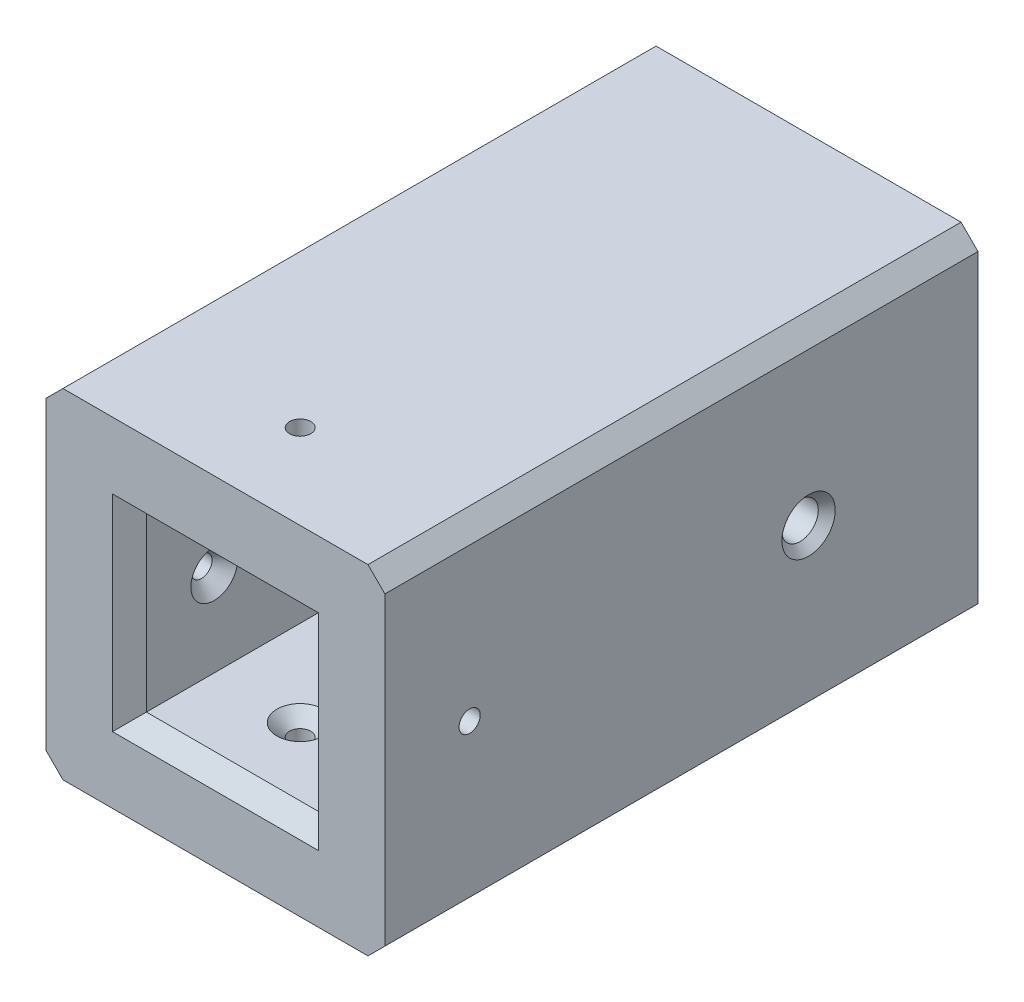
ISO-10303-21;
HEADER;
FILE_DESCRIPTION(('STEP AP214'),'2;1');
FILE_NAME('part.step','',(''),(''),'','','');
FILE_SCHEMA(('AUTOMOTIVE_DESIGN { 1 0 10303 214 1 1 1 1 }'));
ENDSEC;
DATA;
#1=APPLICATION_CONTEXT('core data for automotive mechanical design processes');
#2=APPLICATION_PROTOCOL_DEFINITION('international standard','automotive_design',2000,#1);
#3=PRODUCT_CONTEXT('',#1,'mechanical');
#4=PRODUCT('Part','Part','',(#3));
#5=PRODUCT_RELATED_PRODUCT_CATEGORY('part','',(#4));
#6=PRODUCT_DEFINITION_FORMATION('','',#4);
#7=PRODUCT_DEFINITION_CONTEXT('part definition',#1,'design');
#8=PRODUCT_DEFINITION('design','',#6,#7);
#9=PRODUCT_DEFINITION_SHAPE('','',#8);
#10=(LENGTH_UNIT() NAMED_UNIT(*) SI_UNIT(.MILLI.,.METRE.));
#11=(NAMED_UNIT(*) PLANE_ANGLE_UNIT() SI_UNIT($,.RADIAN.));
#12=(NAMED_UNIT(*) SI_UNIT($,.STERADIAN.) SOLID_ANGLE_UNIT());
#13=UNCERTAINTY_MEASURE_WITH_UNIT(LENGTH_MEASURE(1.E-05),#10,'distance_accuracy_value','');
#14=(GEOMETRIC_REPRESENTATION_CONTEXT(3) GLOBAL_UNCERTAINTY_ASSIGNED_CONTEXT((#13)) GLOBAL_UNIT_ASSIGNED_CONTEXT((#10,
#11,#12)) REPRESENTATION_CONTEXT('',''));
#15=CARTESIAN_POINT('',(0.,0.,0.));
#16=DIRECTION('',(0.,0.,1.));
#17=DIRECTION('',(1.,0.,0.));
#18=AXIS2_PLACEMENT_3D('',#15,#16,#17);
#19=CARTESIAN_POINT('',(0.,0.,94.));
#20=DIRECTION('',(1.,0.,0.));
#21=DIRECTION('',(0.,0.,-1.));
#22=AXIS2_PLACEMENT_3D('',#19,#20,#21);
#23=PLANE('',#22);
#24=CARTESIAN_POINT('',(0.,20.,84.));
#25=DIRECTION('',(-1.,0.,0.));
#26=DIRECTION('',(0.,0.,1.));
#27=AXIS2_PLACEMENT_3D('',#24,#25,#26);
#28=CIRCLE('',#27,1.25);
#29=CARTESIAN_POINT('',(0.,20.,85.25));
#30=VERTEX_POINT('',#29);
#31=EDGE_CURVE('E271',#30,#30,#28,.T.);
#32=ORIENTED_EDGE('',*,*,#31,.F.);
#33=EDGE_LOOP('',(#32));
#34=FACE_BOUND('',#33,.T.);
#35=CARTESIAN_POINT('',(0.,20.,44.));
#36=DIRECTION('',(1.,0.,0.));
#37=DIRECTION('',(0.,0.,-1.));
#38=AXIS2_PLACEMENT_3D('',#35,#36,#37);
#39=CIRCLE('',#38,3.14999999999996);
#40=CARTESIAN_POINT('',(0.,20.,40.85));
#41=VERTEX_POINT('',#40);
#42=EDGE_CURVE('E209',#41,#41,#39,.T.);
#43=ORIENTED_EDGE('',*,*,#42,.T.);
#44=EDGE_LOOP('',(#43));
#45=FACE_BOUND('',#44,.T.);
#46=DIRECTION('',(0.,1.,0.));
#47=VECTOR('',#46,1.);
#48=CARTESIAN_POINT('',(0.,0.,24.));
#49=LINE('',#48,#47);
#50=CARTESIAN_POINT('',(0.,2.00000000000002,24.));
#51=VERTEX_POINT('',#50);
#52=CARTESIAN_POINT('',(0.,38.,24.));
#53=VERTEX_POINT('',#52);
#54=EDGE_CURVE('E291',#51,#53,#49,.T.);
#55=ORIENTED_EDGE('',*,*,#54,.F.);
#56=DIRECTION('',(0.,0.,1.));
#57=VECTOR('',#56,1.);
#58=CARTESIAN_POINT('',(0.,2.00000000000002,94.));
#59=LINE('',#58,#57);
#60=CARTESIAN_POINT('',(0.,2.00000000000002,94.));
#61=VERTEX_POINT('',#60);
#62=EDGE_CURVE('E191',#51,#61,#59,.T.);
#63=ORIENTED_EDGE('',*,*,#62,.T.);
#64=DIRECTION('',(0.,-1.,0.));
#65=VECTOR('',#64,1.);
#66=CARTESIAN_POINT('',(0.,0.,94.));
#67=LINE('',#66,#65);
#68=CARTESIAN_POINT('',(0.,38.,94.));
#69=VERTEX_POINT('',#68);
#70=EDGE_CURVE('E313',#69,#61,#67,.T.);
#71=ORIENTED_EDGE('',*,*,#70,.F.);
#72=DIRECTION('',(0.,0.,-1.));
#73=VECTOR('',#72,1.);
#74=CARTESIAN_POINT('',(0.,38.,94.));
#75=LINE('',#74,#73);
#76=EDGE_CURVE('E181',#69,#53,#75,.T.);
#77=ORIENTED_EDGE('',*,*,#76,.T.);
#78=EDGE_LOOP('',(#55,#63,#71,#77));
#79=FACE_BOUND('',#78,.T.);
#80=ADVANCED_FACE('F36',(#34,#45,#79),#23,.F.);
#81=CARTESIAN_POINT('',(0.,0.,94.));
#82=DIRECTION('',(0.,1.,0.));
#83=DIRECTION('',(0.,0.,1.));
#84=AXIS2_PLACEMENT_3D('',#81,#82,#83);
#85=PLANE('',#84);
#86=CARTESIAN_POINT('',(20.,0.,84.));
#87=DIRECTION('',(0.,-1.,0.));
#88=DIRECTION('',(0.,0.,-1.));
#89=AXIS2_PLACEMENT_3D('',#86,#87,#88);
#90=CIRCLE('',#89,1.25);
#91=CARTESIAN_POINT('',(20.,0.,82.75));
#92=VERTEX_POINT('',#91);
#93=EDGE_CURVE('E297',#92,#92,#90,.T.);
#94=ORIENTED_EDGE('',*,*,#93,.F.);
#95=EDGE_LOOP('',(#94));
#96=FACE_BOUND('',#95,.T.);
#97=DIRECTION('',(-1.,0.,0.));
#98=VECTOR('',#97,1.);
#99=CARTESIAN_POINT('',(0.,0.,24.));
#100=LINE('',#99,#98);
#101=CARTESIAN_POINT('',(38.,0.,24.));
#102=VERTEX_POINT('',#101);
#103=CARTESIAN_POINT('',(2.,0.,24.));
#104=VERTEX_POINT('',#103);
#105=EDGE_CURVE('E155',#102,#104,#100,.T.);
#106=ORIENTED_EDGE('',*,*,#105,.F.);
#107=DIRECTION('',(0.,0.,1.));
#108=VECTOR('',#107,1.);
#109=CARTESIAN_POINT('',(38.,0.,94.));
#110=LINE('',#109,#108);
#111=CARTESIAN_POINT('',(38.,0.,94.));
#112=VERTEX_POINT('',#111);
#113=EDGE_CURVE('E170',#102,#112,#110,.T.);
#114=ORIENTED_EDGE('',*,*,#113,.T.);
#115=DIRECTION('',(1.,0.,0.));
#116=VECTOR('',#115,1.);
#117=CARTESIAN_POINT('',(0.,0.,94.));
#118=LINE('',#117,#116);
#119=CARTESIAN_POINT('',(2.,0.,94.));
#120=VERTEX_POINT('',#119);
#121=EDGE_CURVE('E316',#120,#112,#118,.T.);
#122=ORIENTED_EDGE('',*,*,#121,.F.);
#123=DIRECTION('',(0.,0.,-1.));
#124=VECTOR('',#123,1.);
#125=CARTESIAN_POINT('',(2.,0.,94.));
#126=LINE('',#125,#124);
#127=EDGE_CURVE('E173',#120,#104,#126,.T.);
#128=ORIENTED_EDGE('',*,*,#127,.T.);
#129=EDGE_LOOP('',(#106,#114,#122,#128));
#130=FACE_BOUND('',#129,.T.);
#131=ADVANCED_FACE('F168',(#96,#130),#85,.F.);
#132=CARTESIAN_POINT('',(40.,0.,94.));
#133=DIRECTION('',(-1.,0.,0.));
#134=DIRECTION('',(0.,0.,1.));
#135=AXIS2_PLACEMENT_3D('',#132,#133,#134);
#136=PLANE('',#135);
#137=CARTESIAN_POINT('',(40.,20.,84.));
#138=DIRECTION('',(-1.,0.,0.));
#139=DIRECTION('',(0.,0.,1.));
#140=AXIS2_PLACEMENT_3D('',#137,#138,#139);
#141=CIRCLE('',#140,1.25);
#142=CARTESIAN_POINT('',(40.,20.,85.25));
#143=VERTEX_POINT('',#142);
#144=EDGE_CURVE('E277',#143,#143,#141,.T.);
#145=ORIENTED_EDGE('',*,*,#144,.T.);
#146=EDGE_LOOP('',(#145));
#147=FACE_BOUND('',#146,.T.);
#148=CARTESIAN_POINT('',(40.,20.,44.));
#149=DIRECTION('',(-1.,0.,0.));
#150=DIRECTION('',(0.,0.,1.));
#151=AXIS2_PLACEMENT_3D('',#148,#149,#150);
#152=CIRCLE('',#151,3.15000000000007);
#153=CARTESIAN_POINT('',(40.,20.,47.1500000000001));
#154=VERTEX_POINT('',#153);
#155=EDGE_CURVE('E164',#154,#154,#152,.T.);
#156=ORIENTED_EDGE('',*,*,#155,.T.);
#157=EDGE_LOOP('',(#156));
#158=FACE_BOUND('',#157,.T.);
#159=DIRECTION('',(0.,-1.,0.));
#160=VECTOR('',#159,1.);
#161=CARTESIAN_POINT('',(40.,0.,24.));
#162=LINE('',#161,#160);
#163=CARTESIAN_POINT('',(40.,38.,24.));
#164=VERTEX_POINT('',#163);
#165=CARTESIAN_POINT('',(40.,2.,24.));
#166=VERTEX_POINT('',#165);
#167=EDGE_CURVE('E158',#164,#166,#162,.T.);
#168=ORIENTED_EDGE('',*,*,#167,.F.);
#169=DIRECTION('',(0.,0.,1.));
#170=VECTOR('',#169,1.);
#171=CARTESIAN_POINT('',(40.,38.,94.));
#172=LINE('',#171,#170);
#173=CARTESIAN_POINT('',(40.,38.,94.));
#174=VERTEX_POINT('',#173);
#175=EDGE_CURVE('E207',#164,#174,#172,.T.);
#176=ORIENTED_EDGE('',*,*,#175,.T.);
#177=DIRECTION('',(0.,1.,0.));
#178=VECTOR('',#177,1.);
#179=CARTESIAN_POINT('',(40.,0.,94.));
#180=LINE('',#179,#178);
#181=CARTESIAN_POINT('',(40.,2.,94.));
#182=VERTEX_POINT('',#181);
#183=EDGE_CURVE('E318',#182,#174,#180,.T.);
#184=ORIENTED_EDGE('',*,*,#183,.F.);
#185=DIRECTION('',(0.,0.,-1.));
#186=VECTOR('',#185,1.);
#187=CARTESIAN_POINT('',(40.,2.,94.));
#188=LINE('',#187,#186);
#189=EDGE_CURVE('E205',#182,#166,#188,.T.);
#190=ORIENTED_EDGE('',*,*,#189,.T.);
#191=EDGE_LOOP('',(#168,#176,#184,#190));
#192=FACE_BOUND('',#191,.T.);
#193=ADVANCED_FACE('F400',(#147,#158,#192),#136,.F.);
#194=CARTESIAN_POINT('',(0.,40.,94.));
#195=DIRECTION('',(0.,-1.,0.));
#196=DIRECTION('',(0.,0.,-1.));
#197=AXIS2_PLACEMENT_3D('',#194,#195,#196);
#198=PLANE('',#197);
#199=CARTESIAN_POINT('',(20.,40.,84.));
#200=DIRECTION('',(0.,-1.,0.));
#201=DIRECTION('',(0.,0.,-1.));
#202=AXIS2_PLACEMENT_3D('',#199,#200,#201);
#203=CIRCLE('',#202,1.25);
#204=CARTESIAN_POINT('',(20.,40.,82.75));
#205=VERTEX_POINT('',#204);
#206=EDGE_CURVE('E300',#205,#205,#203,.T.);
#207=ORIENTED_EDGE('',*,*,#206,.T.);
#208=EDGE_LOOP('',(#207));
#209=FACE_BOUND('',#208,.T.);
#210=DIRECTION('',(1.,0.,0.));
#211=VECTOR('',#210,1.);
#212=CARTESIAN_POINT('',(0.,40.,24.));
#213=LINE('',#212,#211);
#214=CARTESIAN_POINT('',(2.00000000000002,40.,24.));
#215=VERTEX_POINT('',#214);
#216=CARTESIAN_POINT('',(38.,40.,24.));
#217=VERTEX_POINT('',#216);
#218=EDGE_CURVE('E289',#215,#217,#213,.T.);
#219=ORIENTED_EDGE('',*,*,#218,.F.);
#220=DIRECTION('',(0.,0.,1.));
#221=VECTOR('',#220,1.);
#222=CARTESIAN_POINT('',(2.00000000000002,40.,94.));
#223=LINE('',#222,#221);
#224=CARTESIAN_POINT('',(2.00000000000002,40.,94.));
#225=VERTEX_POINT('',#224);
#226=EDGE_CURVE('E203',#215,#225,#223,.T.);
#227=ORIENTED_EDGE('',*,*,#226,.T.);
#228=DIRECTION('',(-1.,0.,0.));
#229=VECTOR('',#228,1.);
#230=CARTESIAN_POINT('',(0.,40.,94.));
#231=LINE('',#230,#229);
#232=CARTESIAN_POINT('',(38.,40.,94.));
#233=VERTEX_POINT('',#232);
#234=EDGE_CURVE('E321',#233,#225,#231,.T.);
#235=ORIENTED_EDGE('',*,*,#234,.F.);
#236=DIRECTION('',(0.,0.,-1.));
#237=VECTOR('',#236,1.);
#238=CARTESIAN_POINT('',(38.,40.,94.));
#239=LINE('',#238,#237);
#240=EDGE_CURVE('E200',#233,#217,#239,.T.);
#241=ORIENTED_EDGE('',*,*,#240,.T.);
#242=EDGE_LOOP('',(#219,#227,#235,#241));
#243=FACE_BOUND('',#242,.T.);
#244=ADVANCED_FACE('F521',(#209,#243),#198,.F.);
#245=CARTESIAN_POINT('',(9.85,9.85,94.));
#246=DIRECTION('',(1.,0.,0.));
#247=DIRECTION('',(0.,0.,-1.));
#248=AXIS2_PLACEMENT_3D('',#245,#246,#247);
#249=PLANE('',#248);
#250=CARTESIAN_POINT('',(9.85,20.,84.));
#251=DIRECTION('',(1.,0.,0.));
#252=DIRECTION('',(0.,0.,-1.));
#253=AXIS2_PLACEMENT_3D('',#250,#251,#252);
#254=CIRCLE('',#253,2.74999999999999);
#255=CARTESIAN_POINT('',(9.85,20.,81.25));
#256=VERTEX_POINT('',#255);
#257=EDGE_CURVE('E233',#256,#256,#254,.F.);
#258=ORIENTED_EDGE('',*,*,#257,.T.);
#259=EDGE_LOOP('',(#258));
#260=FACE_BOUND('',#259,.T.);
#261=CARTESIAN_POINT('',(9.85,20.,44.));
#262=DIRECTION('',(1.,0.,0.));
#263=DIRECTION('',(0.,0.,-1.));
#264=AXIS2_PLACEMENT_3D('',#261,#262,#263);
#265=CIRCLE('',#264,2.15);
#266=CARTESIAN_POINT('',(9.85,20.,41.85));
#267=VERTEX_POINT('',#266);
#268=EDGE_CURVE('E213',#267,#267,#265,.T.);
#269=ORIENTED_EDGE('',*,*,#268,.F.);
#270=EDGE_LOOP('',(#269));
#271=FACE_BOUND('',#270,.T.);
#272=DIRECTION('',(0.,0.,-1.));
#273=VECTOR('',#272,1.);
#274=CARTESIAN_POINT('',(9.85,9.85,94.));
#275=LINE('',#274,#273);
#276=CARTESIAN_POINT('',(9.85,9.85,92.));
#277=VERTEX_POINT('',#276);
#278=CARTESIAN_POINT('',(9.85,9.85,26.));
#279=VERTEX_POINT('',#278);
#280=EDGE_CURVE('E310',#277,#279,#275,.T.);
#281=ORIENTED_EDGE('',*,*,#280,.T.);
#282=DIRECTION('',(0.,1.,0.));
#283=VECTOR('',#282,1.);
#284=CARTESIAN_POINT('',(9.85,9.85,26.));
#285=LINE('',#284,#283);
#286=CARTESIAN_POINT('',(9.85,30.15,26.));
#287=VERTEX_POINT('',#286);
#288=EDGE_CURVE('E248',#279,#287,#285,.T.);
#289=ORIENTED_EDGE('',*,*,#288,.T.);
#290=DIRECTION('',(0.,0.,-1.));
#291=VECTOR('',#290,1.);
#292=CARTESIAN_POINT('',(9.85,30.15,94.));
#293=LINE('',#292,#291);
#294=CARTESIAN_POINT('',(9.85,30.15,92.));
#295=VERTEX_POINT('',#294);
#296=EDGE_CURVE('E304',#295,#287,#293,.T.);
#297=ORIENTED_EDGE('',*,*,#296,.F.);
#298=DIRECTION('',(0.,-1.,0.));
#299=VECTOR('',#298,1.);
#300=CARTESIAN_POINT('',(9.85,9.85,92.));
#301=LINE('',#300,#299);
#302=EDGE_CURVE('E324',#295,#277,#301,.T.);
#303=ORIENTED_EDGE('',*,*,#302,.T.);
#304=EDGE_LOOP('',(#281,#289,#297,#303));
#305=FACE_BOUND('',#304,.T.);
#306=ADVANCED_FACE('F371',(#260,#271,#305),#249,.T.);
#307=CARTESIAN_POINT('',(9.85,9.85,94.));
#308=DIRECTION('',(0.,1.,0.));
#309=DIRECTION('',(0.,0.,1.));
#310=AXIS2_PLACEMENT_3D('',#307,#308,#309);
#311=PLANE('',#310);
#312=CARTESIAN_POINT('',(20.,9.85,84.));
#313=DIRECTION('',(0.,1.,0.));
#314=DIRECTION('',(0.,0.,1.));
#315=AXIS2_PLACEMENT_3D('',#312,#313,#314);
#316=CIRCLE('',#315,2.74999999999999);
#317=CARTESIAN_POINT('',(20.,9.85,86.75));
#318=VERTEX_POINT('',#317);
#319=EDGE_CURVE('E227',#318,#318,#316,.F.);
#320=ORIENTED_EDGE('',*,*,#319,.T.);
#321=EDGE_LOOP('',(#320));
#322=FACE_BOUND('',#321,.T.);
#323=DIRECTION('',(0.,0.,-1.));
#324=VECTOR('',#323,1.);
#325=CARTESIAN_POINT('',(30.15,9.85,94.));
#326=LINE('',#325,#324);
#327=CARTESIAN_POINT('',(30.15,9.85,92.));
#328=VERTEX_POINT('',#327);
#329=CARTESIAN_POINT('',(30.15,9.85,26.));
#330=VERTEX_POINT('',#329);
#331=EDGE_CURVE('E308',#328,#330,#326,.T.);
#332=ORIENTED_EDGE('',*,*,#331,.T.);
#333=DIRECTION('',(-1.,0.,0.));
#334=VECTOR('',#333,1.);
#335=CARTESIAN_POINT('',(9.85,9.85,26.));
#336=LINE('',#335,#334);
#337=EDGE_CURVE('E11',#330,#279,#336,.T.);
#338=ORIENTED_EDGE('',*,*,#337,.T.);
#339=ORIENTED_EDGE('',*,*,#280,.F.);
#340=DIRECTION('',(1.,0.,0.));
#341=VECTOR('',#340,1.);
#342=CARTESIAN_POINT('',(30.15,9.85,92.));
#343=LINE('',#342,#341);
#344=EDGE_CURVE('E336',#277,#328,#343,.T.);
#345=ORIENTED_EDGE('',*,*,#344,.T.);
#346=EDGE_LOOP('',(#332,#338,#339,#345));
#347=FACE_BOUND('',#346,.T.);
#348=ADVANCED_FACE('F373',(#322,#347),#311,.T.);
#349=CARTESIAN_POINT('',(30.15,9.85,94.));
#350=DIRECTION('',(-1.,0.,0.));
#351=DIRECTION('',(0.,0.,1.));
#352=AXIS2_PLACEMENT_3D('',#349,#350,#351);
#353=PLANE('',#352);
#354=CARTESIAN_POINT('',(30.15,20.,84.));
#355=DIRECTION('',(-1.,0.,0.));
#356=DIRECTION('',(0.,0.,1.));
#357=AXIS2_PLACEMENT_3D('',#354,#355,#356);
#358=CIRCLE('',#357,2.75);
#359=CARTESIAN_POINT('',(30.15,20.,86.75));
#360=VERTEX_POINT('',#359);
#361=EDGE_CURVE('E245',#360,#360,#358,.F.);
#362=ORIENTED_EDGE('',*,*,#361,.T.);
#363=EDGE_LOOP('',(#362));
#364=FACE_BOUND('',#363,.T.);
#365=CARTESIAN_POINT('',(30.15,20.,44.));
#366=DIRECTION('',(-1.,0.,0.));
#367=DIRECTION('',(0.,0.,1.));
#368=AXIS2_PLACEMENT_3D('',#365,#366,#367);
#369=CIRCLE('',#368,2.15);
#370=CARTESIAN_POINT('',(30.15,20.,41.85));
#371=VERTEX_POINT('',#370);
#372=EDGE_CURVE('E210',#371,#371,#369,.T.);
#373=ORIENTED_EDGE('',*,*,#372,.F.);
#374=EDGE_LOOP('',(#373));
#375=FACE_BOUND('',#374,.T.);
#376=DIRECTION('',(0.,0.,-1.));
#377=VECTOR('',#376,1.);
#378=CARTESIAN_POINT('',(30.15,30.15,94.));
#379=LINE('',#378,#377);
#380=CARTESIAN_POINT('',(30.15,30.15,92.));
#381=VERTEX_POINT('',#380);
#382=CARTESIAN_POINT('',(30.15,30.15,26.));
#383=VERTEX_POINT('',#382);
#384=EDGE_CURVE('E306',#381,#383,#379,.T.);
#385=ORIENTED_EDGE('',*,*,#384,.T.);
#386=DIRECTION('',(0.,-1.,0.));
#387=VECTOR('',#386,1.);
#388=CARTESIAN_POINT('',(30.15,9.85,26.));
#389=LINE('',#388,#387);
#390=EDGE_CURVE('E46',#383,#330,#389,.T.);
#391=ORIENTED_EDGE('',*,*,#390,.T.);
#392=ORIENTED_EDGE('',*,*,#331,.F.);
#393=DIRECTION('',(0.,1.,0.));
#394=VECTOR('',#393,1.);
#395=CARTESIAN_POINT('',(30.15,30.15,92.));
#396=LINE('',#395,#394);
#397=EDGE_CURVE('E183',#328,#381,#396,.T.);
#398=ORIENTED_EDGE('',*,*,#397,.T.);
#399=EDGE_LOOP('',(#385,#391,#392,#398));
#400=FACE_BOUND('',#399,.T.);
#401=ADVANCED_FACE('F381',(#364,#375,#400),#353,.T.);
#402=CARTESIAN_POINT('',(9.85,30.15,94.));
#403=DIRECTION('',(0.,-1.,0.));
#404=DIRECTION('',(0.,0.,-1.));
#405=AXIS2_PLACEMENT_3D('',#402,#403,#404);
#406=PLANE('',#405);
#407=CARTESIAN_POINT('',(20.,30.15,84.));
#408=DIRECTION('',(0.,-1.,0.));
#409=DIRECTION('',(0.,0.,-1.));
#410=AXIS2_PLACEMENT_3D('',#407,#408,#409);
#411=CIRCLE('',#410,2.75000000000002);
#412=CARTESIAN_POINT('',(20.,30.15,81.25));
#413=VERTEX_POINT('',#412);
#414=EDGE_CURVE('E239',#413,#413,#411,.F.);
#415=ORIENTED_EDGE('',*,*,#414,.T.);
#416=EDGE_LOOP('',(#415));
#417=FACE_BOUND('',#416,.T.);
#418=ORIENTED_EDGE('',*,*,#296,.T.);
#419=DIRECTION('',(1.,0.,0.));
#420=VECTOR('',#419,1.);
#421=CARTESIAN_POINT('',(9.85,30.15,26.));
#422=LINE('',#421,#420);
#423=EDGE_CURVE('E61',#287,#383,#422,.T.);
#424=ORIENTED_EDGE('',*,*,#423,.T.);
#425=ORIENTED_EDGE('',*,*,#384,.F.);
#426=DIRECTION('',(-1.,0.,0.));
#427=VECTOR('',#426,1.);
#428=CARTESIAN_POINT('',(9.85,30.15,92.));
#429=LINE('',#428,#427);
#430=EDGE_CURVE('E179',#381,#295,#429,.T.);
#431=ORIENTED_EDGE('',*,*,#430,.T.);
#432=EDGE_LOOP('',(#418,#424,#425,#431));
#433=FACE_BOUND('',#432,.T.);
#434=ADVANCED_FACE('F380',(#417,#433),#406,.T.);
#435=CARTESIAN_POINT('',(2.,0.,94.));
#436=DIRECTION('',(0.70710678118655,0.707106781186545,0.));
#437=DIRECTION('',(0.,0.,-1.));
#438=AXIS2_PLACEMENT_3D('',#435,#436,#437);
#439=PLANE('',#438);
#440=ORIENTED_EDGE('',*,*,#62,.F.);
#441=DIRECTION('',(-0.707106781186545,0.70710678118655,0.));
#442=VECTOR('',#441,1.);
#443=CARTESIAN_POINT('',(2.,0.,24.));
#444=LINE('',#443,#442);
#445=EDGE_CURVE('E287',#51,#104,#444,.F.);
#446=ORIENTED_EDGE('',*,*,#445,.T.);
#447=ORIENTED_EDGE('',*,*,#127,.F.);
#448=DIRECTION('',(-0.707106781186545,0.70710678118655,0.));
#449=VECTOR('',#448,1.);
#450=CARTESIAN_POINT('',(2.,0.,94.));
#451=LINE('',#450,#449);
#452=EDGE_CURVE('E198',#61,#120,#451,.F.);
#453=ORIENTED_EDGE('',*,*,#452,.F.);
#454=EDGE_LOOP('',(#440,#446,#447,#453));
#455=FACE_BOUND('',#454,.T.);
#456=ADVANCED_FACE('F428',(#455),#439,.F.);
#457=CARTESIAN_POINT('',(0.,38.,94.));
#458=DIRECTION('',(0.707106781186545,-0.70710678118655,0.));
#459=DIRECTION('',(0.,0.,-1.));
#460=AXIS2_PLACEMENT_3D('',#457,#458,#459);
#461=PLANE('',#460);
#462=ORIENTED_EDGE('',*,*,#226,.F.);
#463=DIRECTION('',(0.70710678118655,0.707106781186545,0.));
#464=VECTOR('',#463,1.);
#465=CARTESIAN_POINT('',(0.,38.,24.));
#466=LINE('',#465,#464);
#467=EDGE_CURVE('E214',#215,#53,#466,.F.);
#468=ORIENTED_EDGE('',*,*,#467,.T.);
#469=ORIENTED_EDGE('',*,*,#76,.F.);
#470=DIRECTION('',(0.70710678118655,0.707106781186545,0.));
#471=VECTOR('',#470,1.);
#472=CARTESIAN_POINT('',(0.,38.,94.));
#473=LINE('',#472,#471);
#474=EDGE_CURVE('E196',#225,#69,#473,.F.);
#475=ORIENTED_EDGE('',*,*,#474,.F.);
#476=EDGE_LOOP('',(#462,#468,#469,#475));
#477=FACE_BOUND('',#476,.T.);
#478=ADVANCED_FACE('F434',(#477),#461,.F.);
#479=CARTESIAN_POINT('',(38.,40.,94.));
#480=DIRECTION('',(-0.70710678118655,-0.707106781186545,0.));
#481=DIRECTION('',(0.,0.,-1.));
#482=AXIS2_PLACEMENT_3D('',#479,#480,#481);
#483=PLANE('',#482);
#484=ORIENTED_EDGE('',*,*,#175,.F.);
#485=DIRECTION('',(0.707106781186545,-0.70710678118655,0.));
#486=VECTOR('',#485,1.);
#487=CARTESIAN_POINT('',(38.,40.,24.));
#488=LINE('',#487,#486);
#489=EDGE_CURVE('E174',#164,#217,#488,.F.);
#490=ORIENTED_EDGE('',*,*,#489,.T.);
#491=ORIENTED_EDGE('',*,*,#240,.F.);
#492=DIRECTION('',(0.707106781186545,-0.70710678118655,0.));
#493=VECTOR('',#492,1.);
#494=CARTESIAN_POINT('',(38.,40.,94.));
#495=LINE('',#494,#493);
#496=EDGE_CURVE('E194',#174,#233,#495,.F.);
#497=ORIENTED_EDGE('',*,*,#496,.F.);
#498=EDGE_LOOP('',(#484,#490,#491,#497));
#499=FACE_BOUND('',#498,.T.);
#500=ADVANCED_FACE('F441',(#499),#483,.F.);
#501=CARTESIAN_POINT('',(40.,2.,94.));
#502=DIRECTION('',(-0.707106781186545,0.70710678118655,0.));
#503=DIRECTION('',(0.,0.,-1.));
#504=AXIS2_PLACEMENT_3D('',#501,#502,#503);
#505=PLANE('',#504);
#506=ORIENTED_EDGE('',*,*,#113,.F.);
#507=DIRECTION('',(-0.70710678118655,-0.707106781186545,0.));
#508=VECTOR('',#507,1.);
#509=CARTESIAN_POINT('',(40.,2.,24.));
#510=LINE('',#509,#508);
#511=EDGE_CURVE('E152',#102,#166,#510,.F.);
#512=ORIENTED_EDGE('',*,*,#511,.T.);
#513=ORIENTED_EDGE('',*,*,#189,.F.);
#514=DIRECTION('',(-0.70710678118655,-0.707106781186545,0.));
#515=VECTOR('',#514,1.);
#516=CARTESIAN_POINT('',(40.,2.,94.));
#517=LINE('',#516,#515);
#518=EDGE_CURVE('E178',#112,#182,#517,.F.);
#519=ORIENTED_EDGE('',*,*,#518,.F.);
#520=EDGE_LOOP('',(#506,#512,#513,#519));
#521=FACE_BOUND('',#520,.T.);
#522=ADVANCED_FACE('F177',(#521),#505,.F.);
#523=CARTESIAN_POINT('',(0.,0.,94.));
#524=DIRECTION('',(0.,0.,-1.));
#525=DIRECTION('',(-1.,0.,0.));
#526=AXIS2_PLACEMENT_3D('',#523,#524,#525);
#527=PLANE('',#526);
#528=DIRECTION('',(-1.,0.,0.));
#529=VECTOR('',#528,1.);
#530=CARTESIAN_POINT('',(9.85,7.85,94.));
#531=LINE('',#530,#529);
#532=CARTESIAN_POINT('',(32.15,7.85,94.));
#533=VERTEX_POINT('',#532);
#534=CARTESIAN_POINT('',(7.85,7.85,94.));
#535=VERTEX_POINT('',#534);
#536=EDGE_CURVE('E331',#533,#535,#531,.T.);
#537=ORIENTED_EDGE('',*,*,#536,.T.);
#538=DIRECTION('',(0.,1.,0.));
#539=VECTOR('',#538,1.);
#540=CARTESIAN_POINT('',(7.85,30.15,94.));
#541=LINE('',#540,#539);
#542=CARTESIAN_POINT('',(7.85,32.15,94.));
#543=VERTEX_POINT('',#542);
#544=EDGE_CURVE('E333',#535,#543,#541,.T.);
#545=ORIENTED_EDGE('',*,*,#544,.T.);
#546=DIRECTION('',(1.,0.,0.));
#547=VECTOR('',#546,1.);
#548=CARTESIAN_POINT('',(30.15,32.15,94.));
#549=LINE('',#548,#547);
#550=CARTESIAN_POINT('',(32.15,32.15,94.));
#551=VERTEX_POINT('',#550);
#552=EDGE_CURVE('E327',#543,#551,#549,.T.);
#553=ORIENTED_EDGE('',*,*,#552,.T.);
#554=DIRECTION('',(0.,-1.,0.));
#555=VECTOR('',#554,1.);
#556=CARTESIAN_POINT('',(32.15,9.85,94.));
#557=LINE('',#556,#555);
#558=EDGE_CURVE('E329',#551,#533,#557,.T.);
#559=ORIENTED_EDGE('',*,*,#558,.T.);
#560=EDGE_LOOP('',(#537,#545,#553,#559));
#561=FACE_BOUND('',#560,.T.);
#562=ORIENTED_EDGE('',*,*,#70,.T.);
#563=ORIENTED_EDGE('',*,*,#452,.T.);
#564=ORIENTED_EDGE('',*,*,#121,.T.);
#565=ORIENTED_EDGE('',*,*,#518,.T.);
#566=ORIENTED_EDGE('',*,*,#183,.T.);
#567=ORIENTED_EDGE('',*,*,#496,.T.);
#568=ORIENTED_EDGE('',*,*,#234,.T.);
#569=ORIENTED_EDGE('',*,*,#474,.T.);
#570=EDGE_LOOP('',(#562,#563,#564,#565,#566,#567,#568,#569));
#571=FACE_BOUND('',#570,.T.);
#572=ADVANCED_FACE('F359',(#561,#571),#527,.F.);
#573=CARTESIAN_POINT('',(30.15,9.85,92.));
#574=DIRECTION('',(-0.707106781186543,0.,0.707106781186552));
#575=DIRECTION('',(0.,-1.,0.));
#576=AXIS2_PLACEMENT_3D('',#573,#574,#575);
#577=PLANE('',#576);
#578=DIRECTION('',(0.577350269189628,-0.577350269189628,0.57735026918962));
#579=VECTOR('',#578,1.);
#580=CARTESIAN_POINT('',(23.3833333333333,16.6166666666667,85.2333333333334));
#581=LINE('',#580,#579);
#582=EDGE_CURVE('E341',#533,#328,#581,.F.);
#583=ORIENTED_EDGE('',*,*,#582,.F.);
#584=ORIENTED_EDGE('',*,*,#558,.F.);
#585=DIRECTION('',(0.577350269189628,0.577350269189628,0.57735026918962));
#586=VECTOR('',#585,1.);
#587=CARTESIAN_POINT('',(23.3833333333333,23.3833333333333,85.2333333333334));
#588=LINE('',#587,#586);
#589=EDGE_CURVE('E186',#381,#551,#588,.T.);
#590=ORIENTED_EDGE('',*,*,#589,.F.);
#591=ORIENTED_EDGE('',*,*,#397,.F.);
#592=EDGE_LOOP('',(#583,#584,#590,#591));
#593=FACE_BOUND('',#592,.T.);
#594=ADVANCED_FACE('F357',(#593),#577,.T.);
#595=CARTESIAN_POINT('',(9.85,30.15,92.));
#596=DIRECTION('',(0.,-0.707106781186543,0.707106781186552));
#597=DIRECTION('',(1.,0.,0.));
#598=AXIS2_PLACEMENT_3D('',#595,#596,#597);
#599=PLANE('',#598);
#600=ORIENTED_EDGE('',*,*,#589,.T.);
#601=ORIENTED_EDGE('',*,*,#552,.F.);
#602=DIRECTION('',(0.577350269189628,-0.577350269189628,-0.57735026918962));
#603=VECTOR('',#602,1.);
#604=CARTESIAN_POINT('',(16.6166666666667,23.3833333333333,85.2333333333334));
#605=LINE('',#604,#603);
#606=EDGE_CURVE('E340',#295,#543,#605,.F.);
#607=ORIENTED_EDGE('',*,*,#606,.F.);
#608=ORIENTED_EDGE('',*,*,#430,.F.);
#609=EDGE_LOOP('',(#600,#601,#607,#608));
#610=FACE_BOUND('',#609,.T.);
#611=ADVANCED_FACE('F352',(#610),#599,.T.);
#612=CARTESIAN_POINT('',(9.85,9.85,92.));
#613=DIRECTION('',(0.,0.707106781186543,0.707106781186552));
#614=DIRECTION('',(-1.,0.,0.));
#615=AXIS2_PLACEMENT_3D('',#612,#613,#614);
#616=PLANE('',#615);
#617=ORIENTED_EDGE('',*,*,#582,.T.);
#618=ORIENTED_EDGE('',*,*,#344,.F.);
#619=DIRECTION('',(-0.577350269189628,-0.577350269189628,0.57735026918962));
#620=VECTOR('',#619,1.);
#621=CARTESIAN_POINT('',(9.85,9.85,92.));
#622=LINE('',#621,#620);
#623=EDGE_CURVE('E303',#535,#277,#622,.F.);
#624=ORIENTED_EDGE('',*,*,#623,.F.);
#625=ORIENTED_EDGE('',*,*,#536,.F.);
#626=EDGE_LOOP('',(#617,#618,#624,#625));
#627=FACE_BOUND('',#626,.T.);
#628=ADVANCED_FACE('F366',(#627),#616,.T.);
#629=CARTESIAN_POINT('',(9.85,9.85,92.));
#630=DIRECTION('',(0.707106781186543,0.,0.707106781186552));
#631=DIRECTION('',(0.,1.,0.));
#632=AXIS2_PLACEMENT_3D('',#629,#630,#631);
#633=PLANE('',#632);
#634=ORIENTED_EDGE('',*,*,#606,.T.);
#635=ORIENTED_EDGE('',*,*,#544,.F.);
#636=ORIENTED_EDGE('',*,*,#623,.T.);
#637=ORIENTED_EDGE('',*,*,#302,.F.);
#638=EDGE_LOOP('',(#634,#635,#636,#637));
#639=FACE_BOUND('',#638,.T.);
#640=ADVANCED_FACE('F364',(#639),#633,.T.);
#641=CARTESIAN_POINT('',(20.,48.,84.));
#642=DIRECTION('',(0.,-1.,0.));
#643=DIRECTION('',(0.,0.,-1.));
#644=AXIS2_PLACEMENT_3D('',#641,#642,#643);
#645=CYLINDRICAL_SURFACE('',#644,1.25);
#646=CARTESIAN_POINT('',(20.,31.65,84.));
#647=DIRECTION('',(0.,-1.,0.));
#648=DIRECTION('',(0.,0.,-1.));
#649=AXIS2_PLACEMENT_3D('',#646,#647,#648);
#650=CIRCLE('',#649,1.25);
#651=CARTESIAN_POINT('',(20.,31.65,82.75));
#652=VERTEX_POINT('',#651);
#653=EDGE_CURVE('E236',#652,#652,#650,.T.);
#654=ORIENTED_EDGE('',*,*,#653,.T.);
#655=EDGE_LOOP('',(#654));
#656=FACE_BOUND('',#655,.T.);
#657=ORIENTED_EDGE('',*,*,#206,.F.);
#658=EDGE_LOOP('',(#657));
#659=FACE_BOUND('',#658,.T.);
#660=ADVANCED_FACE('F413',(#656,#659),#645,.F.);
#661=CARTESIAN_POINT('',(20.,8.35000000000001,84.));
#662=DIRECTION('',(0.,1.,0.));
#663=DIRECTION('',(0.,0.,1.));
#664=AXIS2_PLACEMENT_3D('',#661,#662,#663);
#665=CIRCLE('',#664,1.25);
#666=CARTESIAN_POINT('',(20.,8.35000000000001,85.25));
#667=VERTEX_POINT('',#666);
#668=EDGE_CURVE('E163',#667,#667,#665,.T.);
#669=ORIENTED_EDGE('',*,*,#668,.T.);
#670=EDGE_LOOP('',(#669));
#671=FACE_BOUND('',#670,.T.);
#672=ORIENTED_EDGE('',*,*,#93,.T.);
#673=EDGE_LOOP('',(#672));
#674=FACE_BOUND('',#673,.T.);
#675=ADVANCED_FACE('F561',(#671,#674),#645,.F.);
#676=CARTESIAN_POINT('',(-39.,20.,44.));
#677=DIRECTION('',(1.,0.,0.));
#678=DIRECTION('',(0.,0.,-1.));
#679=AXIS2_PLACEMENT_3D('',#676,#677,#678);
#680=CYLINDRICAL_SURFACE('',#679,2.15);
#681=CARTESIAN_POINT('',(38.9999999999999,20.,44.));
#682=DIRECTION('',(-1.,0.,0.));
#683=DIRECTION('',(0.,0.,1.));
#684=AXIS2_PLACEMENT_3D('',#681,#682,#683);
#685=CIRCLE('',#684,2.15);
#686=CARTESIAN_POINT('',(38.9999999999999,20.,41.85));
#687=VERTEX_POINT('',#686);
#688=EDGE_CURVE('E220',#687,#687,#685,.F.);
#689=CARTESIAN_POINT('',(38.9999999999999,20.,41.85));
#690=CARTESIAN_POINT('',(38.9078124999999,20.,41.85));
#691=CARTESIAN_POINT('',(38.8156249999999,20.,41.85));
#692=CARTESIAN_POINT('',(38.63125,20.,41.85));
#693=CARTESIAN_POINT('',(38.5390624999999,20.,41.85));
#694=CARTESIAN_POINT('',(38.3546874999999,20.,41.85));
#695=CARTESIAN_POINT('',(38.2624999999999,20.,41.85));
#696=CARTESIAN_POINT('',(38.078125,20.,41.85));
#697=CARTESIAN_POINT('',(37.9859375,20.,41.85));
#698=CARTESIAN_POINT('',(37.8015625,20.,41.85));
#699=CARTESIAN_POINT('',(37.7093749999999,20.,41.85));
#700=CARTESIAN_POINT('',(37.5249999999999,20.,41.85));
#701=CARTESIAN_POINT('',(37.4328125,20.,41.85));
#702=CARTESIAN_POINT('',(37.2484375,20.,41.85));
#703=CARTESIAN_POINT('',(37.15625,20.,41.85));
#704=CARTESIAN_POINT('',(36.971875,20.,41.85));
#705=CARTESIAN_POINT('',(36.8796875,20.,41.85));
#706=CARTESIAN_POINT('',(36.6953125,20.,41.85));
#707=CARTESIAN_POINT('',(36.603125,20.,41.85));
#708=CARTESIAN_POINT('',(36.41875,20.,41.85));
#709=CARTESIAN_POINT('',(36.3265625,20.,41.85));
#710=CARTESIAN_POINT('',(36.1421875,20.,41.85));
#711=CARTESIAN_POINT('',(36.05,20.,41.85));
#712=CARTESIAN_POINT('',(35.865625,20.,41.85));
#713=CARTESIAN_POINT('',(35.7734375,20.,41.85));
#714=CARTESIAN_POINT('',(35.5890625,20.,41.85));
#715=CARTESIAN_POINT('',(35.496875,20.,41.85));
#716=CARTESIAN_POINT('',(35.3125,20.,41.85));
#717=CARTESIAN_POINT('',(35.2203125,20.,41.85));
#718=CARTESIAN_POINT('',(35.0359375,20.,41.85));
#719=CARTESIAN_POINT('',(34.94375,20.,41.85));
#720=CARTESIAN_POINT('',(34.759375,20.,41.85));
#721=CARTESIAN_POINT('',(34.6671875,20.,41.85));
#722=CARTESIAN_POINT('',(34.4828125,20.,41.85));
#723=CARTESIAN_POINT('',(34.390625,20.,41.85));
#724=CARTESIAN_POINT('',(34.20625,20.,41.85));
#725=CARTESIAN_POINT('',(34.1140625,20.,41.85));
#726=CARTESIAN_POINT('',(33.9296875,20.,41.85));
#727=CARTESIAN_POINT('',(33.8375,20.,41.85));
#728=CARTESIAN_POINT('',(33.653125,20.,41.85));
#729=CARTESIAN_POINT('',(33.5609375,20.,41.85));
#730=CARTESIAN_POINT('',(33.3765625,20.,41.85));
#731=CARTESIAN_POINT('',(33.284375,20.,41.85));
#732=CARTESIAN_POINT('',(33.1,20.,41.85));
#733=CARTESIAN_POINT('',(33.0078125,20.,41.85));
#734=CARTESIAN_POINT('',(32.8234375,20.,41.85));
#735=CARTESIAN_POINT('',(32.73125,20.,41.85));
#736=CARTESIAN_POINT('',(32.546875,20.,41.85));
#737=CARTESIAN_POINT('',(32.4546875,20.,41.85));
#738=CARTESIAN_POINT('',(32.2703125,20.,41.85));
#739=CARTESIAN_POINT('',(32.178125,20.,41.85));
#740=CARTESIAN_POINT('',(31.99375,20.,41.85));
#741=CARTESIAN_POINT('',(31.9015625,20.,41.85));
#742=CARTESIAN_POINT('',(31.7171875,20.,41.85));
#743=CARTESIAN_POINT('',(31.625,20.,41.85));
#744=CARTESIAN_POINT('',(31.440625,20.,41.85));
#745=CARTESIAN_POINT('',(31.3484375,20.,41.85));
#746=CARTESIAN_POINT('',(31.1640625,20.,41.85));
#747=CARTESIAN_POINT('',(31.071875,20.,41.85));
#748=CARTESIAN_POINT('',(30.8875,20.,41.85));
#749=CARTESIAN_POINT('',(30.7953125,20.,41.85));
#750=CARTESIAN_POINT('',(30.6109375,20.,41.85));
#751=CARTESIAN_POINT('',(30.51875,20.,41.85));
#752=CARTESIAN_POINT('',(30.334375,20.,41.85));
#753=CARTESIAN_POINT('',(30.2421875,20.,41.85));
#754=CARTESIAN_POINT('',(30.15,20.,41.85));
#755=B_SPLINE_CURVE_WITH_KNOTS('',3,(#689,#690,#691,#692,#693,#694,#695,#696,#697,#698,#699,
#700,#701,#702,#703,#704,#705,#706,#707,#708,#709,#710,#711,#712,#713,#714,#715,#716,#717,#718,
#719,#720,#721,#722,#723,#724,#725,#726,#727,#728,#729,#730,#731,#732,#733,#734,#735,#736,#737,
#738,#739,#740,#741,#742,#743,#744,#745,#746,#747,#748,#749,#750,#751,#752,#753,#754),
.UNSPECIFIED.,.F.,.F.,(4,2,2,2,2,2,2,2,2,2,2,2,2,2,2,2,2,2,2,2,2,2,2,2,2,2,2,2,2,2,2,2,4),(0.,
0.276562499999994,0.553125000000002,0.829687499999995,1.10624999999999,1.3828125,
1.65937499999999,1.93593749999998,2.21249999999998,2.48906249999999,2.76562499999998,
3.04218749999997,3.31874999999998,3.59531249999998,3.87187499999997,4.14843749999998,
4.42499999999997,4.70156249999996,4.97812499999997,5.25468749999997,5.53124999999996,
5.80781249999997,6.08437499999996,6.36093749999996,6.63749999999996,6.91406249999996,
7.19062499999995,7.46718749999994,7.74374999999995,8.02031249999995,8.29687499999994,
8.57343749999995,8.84999999999994),.UNSPECIFIED.);
#756=EDGE_CURVE('BSEAM563',#687,#371,#755,.T.);
#757=ORIENTED_EDGE('',*,*,#688,.T.);
#758=ORIENTED_EDGE('',*,*,#372,.T.);
#759=ORIENTED_EDGE('',*,*,#756,.T.);
#760=ORIENTED_EDGE('',*,*,#756,.F.);
#761=EDGE_LOOP('',(#757,#759,#758,#760));
#762=FACE_BOUND('',#761,.T.);
#763=ADVANCED_FACE('F563',(#762),#680,.F.);
#764=CARTESIAN_POINT('',(0.999999999999952,20.,44.));
#765=DIRECTION('',(1.,0.,0.));
#766=DIRECTION('',(0.,0.,-1.));
#767=AXIS2_PLACEMENT_3D('',#764,#765,#766);
#768=CIRCLE('',#767,2.15);
#769=CARTESIAN_POINT('',(0.999999999999945,20.,41.85));
#770=VERTEX_POINT('',#769);
#771=EDGE_CURVE('E217',#770,#770,#768,.F.);
#772=CARTESIAN_POINT('',(0.999999999999945,20.,41.85));
#773=CARTESIAN_POINT('',(1.09218749999995,20.,41.85));
#774=CARTESIAN_POINT('',(1.18437499999995,20.,41.85));
#775=CARTESIAN_POINT('',(1.36874999999995,20.,41.85));
#776=CARTESIAN_POINT('',(1.46093749999995,20.,41.85));
#777=CARTESIAN_POINT('',(1.64531249999995,20.,41.85));
#778=CARTESIAN_POINT('',(1.73749999999995,20.,41.85));
#779=CARTESIAN_POINT('',(1.92187499999995,20.,41.85));
#780=CARTESIAN_POINT('',(2.01406249999995,20.,41.85));
#781=CARTESIAN_POINT('',(2.19843749999995,20.,41.85));
#782=CARTESIAN_POINT('',(2.29062499999995,20.,41.85));
#783=CARTESIAN_POINT('',(2.47499999999996,20.,41.85));
#784=CARTESIAN_POINT('',(2.56718749999996,20.,41.85));
#785=CARTESIAN_POINT('',(2.75156249999996,20.,41.85));
#786=CARTESIAN_POINT('',(2.84374999999996,20.,41.85));
#787=CARTESIAN_POINT('',(3.02812499999996,20.,41.85));
#788=CARTESIAN_POINT('',(3.12031249999996,20.,41.85));
#789=CARTESIAN_POINT('',(3.30468749999996,20.,41.85));
#790=CARTESIAN_POINT('',(3.39687499999996,20.,41.85));
#791=CARTESIAN_POINT('',(3.58124999999996,20.,41.85));
#792=CARTESIAN_POINT('',(3.67343749999996,20.,41.85));
#793=CARTESIAN_POINT('',(3.85781249999996,20.,41.85));
#794=CARTESIAN_POINT('',(3.94999999999996,20.,41.85));
#795=CARTESIAN_POINT('',(4.13437499999996,20.,41.85));
#796=CARTESIAN_POINT('',(4.22656249999997,20.,41.85));
#797=CARTESIAN_POINT('',(4.41093749999997,20.,41.85));
#798=CARTESIAN_POINT('',(4.50312499999997,20.,41.85));
#799=CARTESIAN_POINT('',(4.68749999999997,20.,41.85));
#800=CARTESIAN_POINT('',(4.77968749999997,20.,41.85));
#801=CARTESIAN_POINT('',(4.96406249999997,20.,41.85));
#802=CARTESIAN_POINT('',(5.05624999999997,20.,41.85));
#803=CARTESIAN_POINT('',(5.24062499999997,20.,41.85));
#804=CARTESIAN_POINT('',(5.33281249999997,20.,41.85));
#805=CARTESIAN_POINT('',(5.51718749999997,20.,41.85));
#806=CARTESIAN_POINT('',(5.60937499999997,20.,41.85));
#807=CARTESIAN_POINT('',(5.79374999999997,20.,41.85));
#808=CARTESIAN_POINT('',(5.88593749999997,20.,41.85));
#809=CARTESIAN_POINT('',(6.07031249999997,20.,41.85));
#810=CARTESIAN_POINT('',(6.16249999999997,20.,41.85));
#811=CARTESIAN_POINT('',(6.34687499999997,20.,41.85));
#812=CARTESIAN_POINT('',(6.43906249999997,20.,41.85));
#813=CARTESIAN_POINT('',(6.62343749999998,20.,41.85));
#814=CARTESIAN_POINT('',(6.71562499999998,20.,41.85));
#815=CARTESIAN_POINT('',(6.89999999999998,20.,41.85));
#816=CARTESIAN_POINT('',(6.99218749999998,20.,41.85));
#817=CARTESIAN_POINT('',(7.17656249999998,20.,41.85));
#818=CARTESIAN_POINT('',(7.26874999999998,20.,41.85));
#819=CARTESIAN_POINT('',(7.45312499999998,20.,41.85));
#820=CARTESIAN_POINT('',(7.54531249999998,20.,41.85));
#821=CARTESIAN_POINT('',(7.72968749999998,20.,41.85));
#822=CARTESIAN_POINT('',(7.82187499999999,20.,41.85));
#823=CARTESIAN_POINT('',(8.00624999999999,20.,41.85));
#824=CARTESIAN_POINT('',(8.09843749999999,20.,41.85));
#825=CARTESIAN_POINT('',(8.28281249999999,20.,41.85));
#826=CARTESIAN_POINT('',(8.37499999999999,20.,41.85));
#827=CARTESIAN_POINT('',(8.55937499999999,20.,41.85));
#828=CARTESIAN_POINT('',(8.65156249999999,20.,41.85));
#829=CARTESIAN_POINT('',(8.83593749999999,20.,41.85));
#830=CARTESIAN_POINT('',(8.92812499999999,20.,41.85));
#831=CARTESIAN_POINT('',(9.11249999999999,20.,41.85));
#832=CARTESIAN_POINT('',(9.20468749999999,20.,41.85));
#833=CARTESIAN_POINT('',(9.3890625,20.,41.85));
#834=CARTESIAN_POINT('',(9.48125,20.,41.85));
#835=CARTESIAN_POINT('',(9.665625,20.,41.85));
#836=CARTESIAN_POINT('',(9.7578125,20.,41.85));
#837=CARTESIAN_POINT('',(9.85,20.,41.85));
#838=B_SPLINE_CURVE_WITH_KNOTS('',3,(#772,#773,#774,#775,#776,#777,#778,#779,#780,#781,#782,
#783,#784,#785,#786,#787,#788,#789,#790,#791,#792,#793,#794,#795,#796,#797,#798,#799,#800,#801,
#802,#803,#804,#805,#806,#807,#808,#809,#810,#811,#812,#813,#814,#815,#816,#817,#818,#819,#820,
#821,#822,#823,#824,#825,#826,#827,#828,#829,#830,#831,#832,#833,#834,#835,#836,#837),
.UNSPECIFIED.,.F.,.F.,(4,2,2,2,2,2,2,2,2,2,2,2,2,2,2,2,2,2,2,2,2,2,2,2,2,2,2,2,2,2,2,2,4),(0.,
0.276562500000001,0.553125000000002,0.829687500000002,1.10625,1.38281250000001,1.65937500000001,
1.93593750000001,2.21250000000001,2.48906250000001,2.76562500000001,3.04218750000002,
3.31875000000002,3.59531250000002,3.87187500000002,4.14843750000003,4.42500000000003,
4.70156250000003,4.97812500000003,5.25468750000003,5.53125000000003,5.80781250000004,
6.08437500000004,6.36093750000004,6.63750000000004,6.91406250000004,7.19062500000004,
7.46718750000004,7.74375000000005,8.02031250000004,8.29687500000005,8.57343750000005,
8.85000000000005),.UNSPECIFIED.);
#839=EDGE_CURVE('BSEAM461',#770,#267,#838,.T.);
#840=ORIENTED_EDGE('',*,*,#771,.T.);
#841=ORIENTED_EDGE('',*,*,#268,.T.);
#842=ORIENTED_EDGE('',*,*,#839,.T.);
#843=ORIENTED_EDGE('',*,*,#839,.F.);
#844=EDGE_LOOP('',(#840,#842,#841,#843));
#845=FACE_BOUND('',#844,.T.);
#846=ADVANCED_FACE('F461',(#845),#680,.F.);
#847=CARTESIAN_POINT('',(0.,20.,44.));
#848=DIRECTION('',(-1.,0.,0.));
#849=DIRECTION('',(0.,0.,1.));
#850=AXIS2_PLACEMENT_3D('',#847,#848,#849);
#851=CONICAL_SURFACE('',#850,3.14999999999996,0.785398163397451);
#852=ORIENTED_EDGE('',*,*,#771,.F.);
#853=EDGE_LOOP('',(#852));
#854=FACE_BOUND('',#853,.T.);
#855=ORIENTED_EDGE('',*,*,#42,.F.);
#856=EDGE_LOOP('',(#855));
#857=FACE_BOUND('',#856,.T.);
#858=ADVANCED_FACE('F454',(#854,#857),#851,.F.);
#859=CARTESIAN_POINT('',(38.9999999999999,20.,44.));
#860=DIRECTION('',(1.,0.,0.));
#861=DIRECTION('',(0.,0.,-1.));
#862=AXIS2_PLACEMENT_3D('',#859,#860,#861);
#863=CONICAL_SURFACE('',#862,2.15,0.785398163397454);
#864=ORIENTED_EDGE('',*,*,#155,.F.);
#865=EDGE_LOOP('',(#864));
#866=FACE_BOUND('',#865,.T.);
#867=ORIENTED_EDGE('',*,*,#688,.F.);
#868=EDGE_LOOP('',(#867));
#869=FACE_BOUND('',#868,.T.);
#870=ADVANCED_FACE('F460',(#866,#869),#863,.F.);
#871=CARTESIAN_POINT('',(0.,0.,24.));
#872=DIRECTION('',(0.,0.,-1.));
#873=DIRECTION('',(-1.,0.,0.));
#874=AXIS2_PLACEMENT_3D('',#871,#872,#873);
#875=PLANE('',#874);
#876=DIRECTION('',(-1.,0.,0.));
#877=VECTOR('',#876,1.);
#878=CARTESIAN_POINT('',(0.,32.15,24.));
#879=LINE('',#878,#877);
#880=CARTESIAN_POINT('',(32.15,32.15,24.));
#881=VERTEX_POINT('',#880);
#882=CARTESIAN_POINT('',(7.85,32.15,24.));
#883=VERTEX_POINT('',#882);
#884=EDGE_CURVE('E255',#881,#883,#879,.T.);
#885=ORIENTED_EDGE('',*,*,#884,.T.);
#886=DIRECTION('',(0.,-1.,0.));
#887=VECTOR('',#886,1.);
#888=CARTESIAN_POINT('',(7.85,0.,24.));
#889=LINE('',#888,#887);
#890=CARTESIAN_POINT('',(7.85,7.85,24.));
#891=VERTEX_POINT('',#890);
#892=EDGE_CURVE('E257',#883,#891,#889,.T.);
#893=ORIENTED_EDGE('',*,*,#892,.T.);
#894=DIRECTION('',(1.,0.,0.));
#895=VECTOR('',#894,1.);
#896=CARTESIAN_POINT('',(0.,7.85,24.));
#897=LINE('',#896,#895);
#898=CARTESIAN_POINT('',(32.15,7.85,24.));
#899=VERTEX_POINT('',#898);
#900=EDGE_CURVE('E251',#891,#899,#897,.T.);
#901=ORIENTED_EDGE('',*,*,#900,.T.);
#902=DIRECTION('',(0.,1.,0.));
#903=VECTOR('',#902,1.);
#904=CARTESIAN_POINT('',(32.15,0.,24.));
#905=LINE('',#904,#903);
#906=EDGE_CURVE('E253',#899,#881,#905,.T.);
#907=ORIENTED_EDGE('',*,*,#906,.T.);
#908=EDGE_LOOP('',(#885,#893,#901,#907));
#909=FACE_BOUND('',#908,.T.);
#910=ORIENTED_EDGE('',*,*,#218,.T.);
#911=ORIENTED_EDGE('',*,*,#489,.F.);
#912=ORIENTED_EDGE('',*,*,#167,.T.);
#913=ORIENTED_EDGE('',*,*,#511,.F.);
#914=ORIENTED_EDGE('',*,*,#105,.T.);
#915=ORIENTED_EDGE('',*,*,#445,.F.);
#916=ORIENTED_EDGE('',*,*,#54,.T.);
#917=ORIENTED_EDGE('',*,*,#467,.F.);
#918=EDGE_LOOP('',(#910,#911,#912,#913,#914,#915,#916,#917));
#919=FACE_BOUND('',#918,.T.);
#920=ADVANCED_FACE('F154',(#909,#919),#875,.T.);
#921=CARTESIAN_POINT('',(49.,20.,84.));
#922=DIRECTION('',(-1.,0.,0.));
#923=DIRECTION('',(0.,0.,1.));
#924=AXIS2_PLACEMENT_3D('',#921,#922,#923);
#925=CYLINDRICAL_SURFACE('',#924,1.25);
#926=CARTESIAN_POINT('',(31.65,20.,84.));
#927=DIRECTION('',(-1.,0.,0.));
#928=DIRECTION('',(0.,0.,1.));
#929=AXIS2_PLACEMENT_3D('',#926,#927,#928);
#930=CIRCLE('',#929,1.25);
#931=CARTESIAN_POINT('',(31.65,20.,85.25));
#932=VERTEX_POINT('',#931);
#933=EDGE_CURVE('E242',#932,#932,#930,.T.);
#934=ORIENTED_EDGE('',*,*,#933,.T.);
#935=EDGE_LOOP('',(#934));
#936=FACE_BOUND('',#935,.T.);
#937=ORIENTED_EDGE('',*,*,#144,.F.);
#938=EDGE_LOOP('',(#937));
#939=FACE_BOUND('',#938,.T.);
#940=ADVANCED_FACE('F513',(#936,#939),#925,.F.);
#941=CARTESIAN_POINT('',(8.35,20.,84.));
#942=DIRECTION('',(1.,0.,0.));
#943=DIRECTION('',(0.,0.,-1.));
#944=AXIS2_PLACEMENT_3D('',#941,#942,#943);
#945=CIRCLE('',#944,1.25);
#946=CARTESIAN_POINT('',(8.35,20.,82.75));
#947=VERTEX_POINT('',#946);
#948=EDGE_CURVE('E230',#947,#947,#945,.T.);
#949=ORIENTED_EDGE('',*,*,#948,.T.);
#950=EDGE_LOOP('',(#949));
#951=FACE_BOUND('',#950,.T.);
#952=ORIENTED_EDGE('',*,*,#31,.T.);
#953=EDGE_LOOP('',(#952));
#954=FACE_BOUND('',#953,.T.);
#955=ADVANCED_FACE('F476',(#951,#954),#925,.F.);
#956=CARTESIAN_POINT('',(20.,8.35000000000001,84.));
#957=DIRECTION('',(0.,1.,0.));
#958=DIRECTION('',(0.,0.,1.));
#959=AXIS2_PLACEMENT_3D('',#956,#957,#958);
#960=CONICAL_SURFACE('',#959,1.25,0.785398163397446);
#961=ORIENTED_EDGE('',*,*,#319,.F.);
#962=EDGE_LOOP('',(#961));
#963=FACE_BOUND('',#962,.T.);
#964=ORIENTED_EDGE('',*,*,#668,.F.);
#965=EDGE_LOOP('',(#964));
#966=FACE_BOUND('',#965,.T.);
#967=ADVANCED_FACE('F469',(#963,#966),#960,.F.);
#968=CARTESIAN_POINT('',(8.35,20.,84.));
#969=DIRECTION('',(1.,0.,0.));
#970=DIRECTION('',(0.,0.,-1.));
#971=AXIS2_PLACEMENT_3D('',#968,#969,#970);
#972=CONICAL_SURFACE('',#971,1.25,0.785398163397447);
#973=ORIENTED_EDGE('',*,*,#257,.F.);
#974=EDGE_LOOP('',(#973));
#975=FACE_BOUND('',#974,.T.);
#976=ORIENTED_EDGE('',*,*,#948,.F.);
#977=EDGE_LOOP('',(#976));
#978=FACE_BOUND('',#977,.T.);
#979=ADVANCED_FACE('F475',(#975,#978),#972,.F.);
#980=CARTESIAN_POINT('',(20.,31.65,84.));
#981=DIRECTION('',(0.,-1.,0.));
#982=DIRECTION('',(0.,0.,-1.));
#983=AXIS2_PLACEMENT_3D('',#980,#981,#982);
#984=CONICAL_SURFACE('',#983,1.25,0.78539816339745);
#985=ORIENTED_EDGE('',*,*,#414,.F.);
#986=EDGE_LOOP('',(#985));
#987=FACE_BOUND('',#986,.T.);
#988=ORIENTED_EDGE('',*,*,#653,.F.);
#989=EDGE_LOOP('',(#988));
#990=FACE_BOUND('',#989,.T.);
#991=ADVANCED_FACE('F483',(#987,#990),#984,.F.);
#992=CARTESIAN_POINT('',(31.65,20.,84.));
#993=DIRECTION('',(-1.,0.,0.));
#994=DIRECTION('',(0.,0.,1.));
#995=AXIS2_PLACEMENT_3D('',#992,#993,#994);
#996=CONICAL_SURFACE('',#995,1.25,0.785398163397449);
#997=ORIENTED_EDGE('',*,*,#361,.F.);
#998=EDGE_LOOP('',(#997));
#999=FACE_BOUND('',#998,.T.);
#1000=ORIENTED_EDGE('',*,*,#933,.F.);
#1001=EDGE_LOOP('',(#1000));
#1002=FACE_BOUND('',#1001,.T.);
#1003=ADVANCED_FACE('F490',(#999,#1002),#996,.F.);
#1004=CARTESIAN_POINT('',(30.15,9.85,26.));
#1005=DIRECTION('',(0.707106781186546,0.,0.707106781186549));
#1006=DIRECTION('',(0.,-1.,0.));
#1007=AXIS2_PLACEMENT_3D('',#1004,#1005,#1006);
#1008=PLANE('',#1007);
#1009=DIRECTION('',(0.577350269189627,0.577350269189627,-0.577350269189624));
#1010=VECTOR('',#1009,1.);
#1011=CARTESIAN_POINT('',(23.3833333333333,23.3833333333333,32.7666666666667));
#1012=LINE('',#1011,#1010);
#1013=EDGE_CURVE('E265',#881,#383,#1012,.F.);
#1014=ORIENTED_EDGE('',*,*,#1013,.F.);
#1015=ORIENTED_EDGE('',*,*,#906,.F.);
#1016=DIRECTION('',(0.577350269189627,-0.577350269189627,-0.577350269189624));
#1017=VECTOR('',#1016,1.);
#1018=CARTESIAN_POINT('',(30.15,9.85,26.));
#1019=LINE('',#1018,#1017);
#1020=EDGE_CURVE('E41',#330,#899,#1019,.T.);
#1021=ORIENTED_EDGE('',*,*,#1020,.F.);
#1022=ORIENTED_EDGE('',*,*,#390,.F.);
#1023=EDGE_LOOP('',(#1014,#1015,#1021,#1022));
#1024=FACE_BOUND('',#1023,.T.);
#1025=ADVANCED_FACE('F39',(#1024),#1008,.F.);
#1026=CARTESIAN_POINT('',(9.85,9.85,26.));
#1027=DIRECTION('',(0.,-0.707106781186546,0.707106781186549));
#1028=DIRECTION('',(-1.,0.,0.));
#1029=AXIS2_PLACEMENT_3D('',#1026,#1027,#1028);
#1030=PLANE('',#1029);
#1031=ORIENTED_EDGE('',*,*,#1020,.T.);
#1032=ORIENTED_EDGE('',*,*,#900,.F.);
#1033=DIRECTION('',(0.577350269189627,0.577350269189627,0.577350269189624));
#1034=VECTOR('',#1033,1.);
#1035=CARTESIAN_POINT('',(9.85,9.85,26.));
#1036=LINE('',#1035,#1034);
#1037=EDGE_CURVE('E264',#279,#891,#1036,.F.);
#1038=ORIENTED_EDGE('',*,*,#1037,.F.);
#1039=ORIENTED_EDGE('',*,*,#337,.F.);
#1040=EDGE_LOOP('',(#1031,#1032,#1038,#1039));
#1041=FACE_BOUND('',#1040,.T.);
#1042=ADVANCED_FACE('F374',(#1041),#1030,.F.);
#1043=CARTESIAN_POINT('',(9.85,30.15,26.));
#1044=DIRECTION('',(0.,0.707106781186546,0.707106781186549));
#1045=DIRECTION('',(1.,0.,0.));
#1046=AXIS2_PLACEMENT_3D('',#1043,#1044,#1045);
#1047=PLANE('',#1046);
#1048=ORIENTED_EDGE('',*,*,#1013,.T.);
#1049=ORIENTED_EDGE('',*,*,#423,.F.);
#1050=DIRECTION('',(-0.577350269189627,0.577350269189627,-0.577350269189624));
#1051=VECTOR('',#1050,1.);
#1052=CARTESIAN_POINT('',(16.6166666666667,23.3833333333333,32.7666666666667));
#1053=LINE('',#1052,#1051);
#1054=EDGE_CURVE('E262',#883,#287,#1053,.F.);
#1055=ORIENTED_EDGE('',*,*,#1054,.F.);
#1056=ORIENTED_EDGE('',*,*,#884,.F.);
#1057=EDGE_LOOP('',(#1048,#1049,#1055,#1056));
#1058=FACE_BOUND('',#1057,.T.);
#1059=ADVANCED_FACE('F385',(#1058),#1047,.F.);
#1060=CARTESIAN_POINT('',(9.85,9.85,26.));
#1061=DIRECTION('',(-0.707106781186546,0.,0.707106781186549));
#1062=DIRECTION('',(0.,1.,0.));
#1063=AXIS2_PLACEMENT_3D('',#1060,#1061,#1062);
#1064=PLANE('',#1063);
#1065=ORIENTED_EDGE('',*,*,#1037,.T.);
#1066=ORIENTED_EDGE('',*,*,#892,.F.);
#1067=ORIENTED_EDGE('',*,*,#1054,.T.);
#1068=ORIENTED_EDGE('',*,*,#288,.F.);
#1069=EDGE_LOOP('',(#1065,#1066,#1067,#1068));
#1070=FACE_BOUND('',#1069,.T.);
#1071=ADVANCED_FACE('F378',(#1070),#1064,.F.);
#1072=CLOSED_SHELL('',(#80,#131,#193,#244,#306,#348,#401,#434,#456,#478,#500,#522,#572,#594,
#611,#628,#640,#660,#675,#763,#846,#858,#870,#920,#940,#955,#967,#979,#991,#1003,#1025,#1042,
#1059,#1071));
#1073=MANIFOLD_SOLID_BREP('B2',#1072);
#1074=ADVANCED_BREP_SHAPE_REPRESENTATION('',(#18,#1073),#14);
#1075=SHAPE_DEFINITION_REPRESENTATION(#9,#1074);
ENDSEC;
END-ISO-10303-21;
